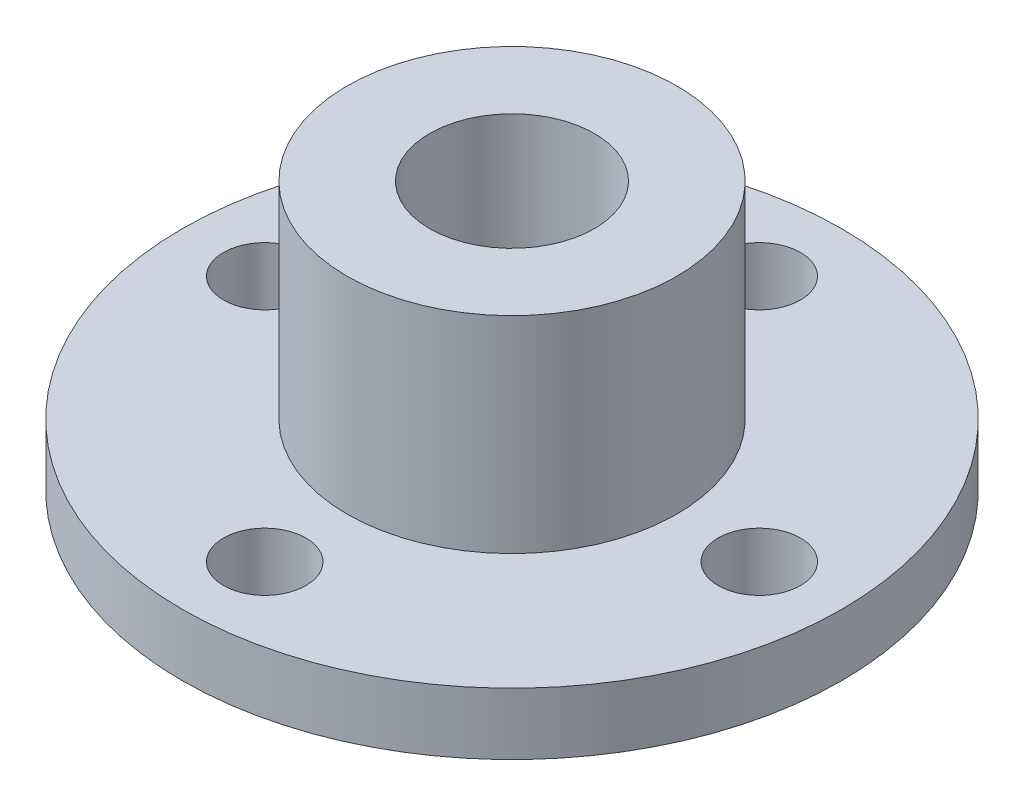
ISO-10303-21;
HEADER;
FILE_DESCRIPTION(('STEP AP214'),'2;1');
FILE_NAME('part.step','',(''),(''),'','','');
FILE_SCHEMA(('AUTOMOTIVE_DESIGN { 1 0 10303 214 1 1 1 1 }'));
ENDSEC;
DATA;
#1=APPLICATION_CONTEXT('core data for automotive mechanical design processes');
#2=APPLICATION_PROTOCOL_DEFINITION('international standard','automotive_design',2000,#1);
#3=PRODUCT_CONTEXT('',#1,'mechanical');
#4=PRODUCT('Part','Part','',(#3));
#5=PRODUCT_RELATED_PRODUCT_CATEGORY('part','',(#4));
#6=PRODUCT_DEFINITION_FORMATION('','',#4);
#7=PRODUCT_DEFINITION_CONTEXT('part definition',#1,'design');
#8=PRODUCT_DEFINITION('design','',#6,#7);
#9=PRODUCT_DEFINITION_SHAPE('','',#8);
#10=(LENGTH_UNIT() NAMED_UNIT(*) SI_UNIT(.MILLI.,.METRE.));
#11=(NAMED_UNIT(*) PLANE_ANGLE_UNIT() SI_UNIT($,.RADIAN.));
#12=(NAMED_UNIT(*) SI_UNIT($,.STERADIAN.) SOLID_ANGLE_UNIT());
#13=UNCERTAINTY_MEASURE_WITH_UNIT(LENGTH_MEASURE(1.E-05),#10,'distance_accuracy_value','');
#14=(GEOMETRIC_REPRESENTATION_CONTEXT(3) GLOBAL_UNCERTAINTY_ASSIGNED_CONTEXT((#13)) GLOBAL_UNIT_ASSIGNED_CONTEXT((#10,
#11,#12)) REPRESENTATION_CONTEXT('',''));
#15=CARTESIAN_POINT('',(0.,0.,0.));
#16=DIRECTION('',(0.,0.,1.));
#17=DIRECTION('',(1.,0.,0.));
#18=AXIS2_PLACEMENT_3D('',#15,#16,#17);
#19=CARTESIAN_POINT('',(0.,3.,0.));
#20=DIRECTION('',(0.,-1.,0.));
#21=DIRECTION('',(0.,0.,-1.));
#22=AXIS2_PLACEMENT_3D('',#19,#20,#21);
#23=CYLINDRICAL_SURFACE('',#22,16.);
#24=CARTESIAN_POINT('',(0.,3.,0.));
#25=DIRECTION('',(0.,1.,0.));
#26=DIRECTION('',(0.,0.,1.));
#27=AXIS2_PLACEMENT_3D('',#24,#25,#26);
#28=CIRCLE('',#27,16.);
#29=CARTESIAN_POINT('',(0.,3.,16.));
#30=VERTEX_POINT('',#29);
#31=EDGE_CURVE('E44',#30,#30,#28,.T.);
#32=ORIENTED_EDGE('',*,*,#31,.F.);
#33=EDGE_LOOP('',(#32));
#34=FACE_BOUND('',#33,.T.);
#35=CARTESIAN_POINT('',(0.,0.,0.));
#36=DIRECTION('',(0.,1.,0.));
#37=DIRECTION('',(0.,0.,1.));
#38=AXIS2_PLACEMENT_3D('',#35,#36,#37);
#39=CIRCLE('',#38,16.);
#40=CARTESIAN_POINT('',(0.,0.,16.));
#41=VERTEX_POINT('',#40);
#42=EDGE_CURVE('E49',#41,#41,#39,.T.);
#43=ORIENTED_EDGE('',*,*,#42,.T.);
#44=EDGE_LOOP('',(#43));
#45=FACE_BOUND('',#44,.T.);
#46=ADVANCED_FACE('F37',(#34,#45),#23,.T.);
#47=CARTESIAN_POINT('',(0.,3.,0.));
#48=DIRECTION('',(0.,1.,0.));
#49=DIRECTION('',(0.,0.,1.));
#50=AXIS2_PLACEMENT_3D('',#47,#48,#49);
#51=PLANE('',#50);
#52=CARTESIAN_POINT('',(0.,3.,-12.));
#53=DIRECTION('',(0.,1.,0.));
#54=DIRECTION('',(0.,0.,1.));
#55=AXIS2_PLACEMENT_3D('',#52,#53,#54);
#56=CIRCLE('',#55,2.);
#57=CARTESIAN_POINT('',(0.,3.,-10.));
#58=VERTEX_POINT('',#57);
#59=EDGE_CURVE('E61',#58,#58,#56,.T.);
#60=ORIENTED_EDGE('',*,*,#59,.F.);
#61=EDGE_LOOP('',(#60));
#62=FACE_BOUND('',#61,.T.);
#63=CARTESIAN_POINT('',(-12.,3.,0.));
#64=DIRECTION('',(0.,1.,0.));
#65=DIRECTION('',(0.,0.,1.));
#66=AXIS2_PLACEMENT_3D('',#63,#64,#65);
#67=CIRCLE('',#66,2.);
#68=CARTESIAN_POINT('',(-12.,3.,2.));
#69=VERTEX_POINT('',#68);
#70=EDGE_CURVE('E84',#69,#69,#67,.T.);
#71=ORIENTED_EDGE('',*,*,#70,.F.);
#72=EDGE_LOOP('',(#71));
#73=FACE_BOUND('',#72,.T.);
#74=CARTESIAN_POINT('',(0.,3.,12.));
#75=DIRECTION('',(0.,1.,0.));
#76=DIRECTION('',(0.,0.,1.));
#77=AXIS2_PLACEMENT_3D('',#74,#75,#76);
#78=CIRCLE('',#77,2.);
#79=CARTESIAN_POINT('',(0.,3.,14.));
#80=VERTEX_POINT('',#79);
#81=EDGE_CURVE('E81',#80,#80,#78,.T.);
#82=ORIENTED_EDGE('',*,*,#81,.F.);
#83=EDGE_LOOP('',(#82));
#84=FACE_BOUND('',#83,.T.);
#85=CARTESIAN_POINT('',(12.,3.,0.));
#86=DIRECTION('',(0.,1.,0.));
#87=DIRECTION('',(0.,0.,1.));
#88=AXIS2_PLACEMENT_3D('',#85,#86,#87);
#89=CIRCLE('',#88,2.);
#90=CARTESIAN_POINT('',(12.,3.,2.));
#91=VERTEX_POINT('',#90);
#92=EDGE_CURVE('E78',#91,#91,#89,.T.);
#93=ORIENTED_EDGE('',*,*,#92,.F.);
#94=EDGE_LOOP('',(#93));
#95=FACE_BOUND('',#94,.T.);
#96=CARTESIAN_POINT('',(0.,3.,0.));
#97=DIRECTION('',(0.,1.,0.));
#98=DIRECTION('',(0.,0.,1.));
#99=AXIS2_PLACEMENT_3D('',#96,#97,#98);
#100=CIRCLE('',#99,8.);
#101=CARTESIAN_POINT('',(0.,3.,8.));
#102=VERTEX_POINT('',#101);
#103=EDGE_CURVE('E10',#102,#102,#100,.T.);
#104=ORIENTED_EDGE('',*,*,#103,.F.);
#105=EDGE_LOOP('',(#104));
#106=FACE_BOUND('',#105,.T.);
#107=ORIENTED_EDGE('',*,*,#31,.T.);
#108=EDGE_LOOP('',(#107));
#109=FACE_BOUND('',#108,.T.);
#110=ADVANCED_FACE('F93',(#62,#73,#84,#95,#106,#109),#51,.T.);
#111=CARTESIAN_POINT('',(0.,0.,0.));
#112=DIRECTION('',(0.,1.,0.));
#113=DIRECTION('',(0.,0.,1.));
#114=AXIS2_PLACEMENT_3D('',#111,#112,#113);
#115=PLANE('',#114);
#116=CARTESIAN_POINT('',(0.,0.,-12.));
#117=DIRECTION('',(0.,1.,0.));
#118=DIRECTION('',(0.,0.,1.));
#119=AXIS2_PLACEMENT_3D('',#116,#117,#118);
#120=CIRCLE('',#119,2.);
#121=CARTESIAN_POINT('',(0.,0.,-10.));
#122=VERTEX_POINT('',#121);
#123=EDGE_CURVE('E40',#122,#122,#120,.T.);
#124=ORIENTED_EDGE('',*,*,#123,.T.);
#125=EDGE_LOOP('',(#124));
#126=FACE_BOUND('',#125,.T.);
#127=CARTESIAN_POINT('',(-12.,0.,0.));
#128=DIRECTION('',(0.,1.,0.));
#129=DIRECTION('',(0.,0.,1.));
#130=AXIS2_PLACEMENT_3D('',#127,#128,#129);
#131=CIRCLE('',#130,2.);
#132=CARTESIAN_POINT('',(-12.,0.,2.));
#133=VERTEX_POINT('',#132);
#134=EDGE_CURVE('E63',#133,#133,#131,.T.);
#135=ORIENTED_EDGE('',*,*,#134,.T.);
#136=EDGE_LOOP('',(#135));
#137=FACE_BOUND('',#136,.T.);
#138=CARTESIAN_POINT('',(0.,0.,12.));
#139=DIRECTION('',(0.,1.,0.));
#140=DIRECTION('',(0.,0.,1.));
#141=AXIS2_PLACEMENT_3D('',#138,#139,#140);
#142=CIRCLE('',#141,2.);
#143=CARTESIAN_POINT('',(0.,0.,14.));
#144=VERTEX_POINT('',#143);
#145=EDGE_CURVE('E60',#144,#144,#142,.T.);
#146=ORIENTED_EDGE('',*,*,#145,.T.);
#147=EDGE_LOOP('',(#146));
#148=FACE_BOUND('',#147,.T.);
#149=CARTESIAN_POINT('',(12.,0.,0.));
#150=DIRECTION('',(0.,1.,0.));
#151=DIRECTION('',(0.,0.,1.));
#152=AXIS2_PLACEMENT_3D('',#149,#150,#151);
#153=CIRCLE('',#152,2.);
#154=CARTESIAN_POINT('',(12.,0.,2.));
#155=VERTEX_POINT('',#154);
#156=EDGE_CURVE('E57',#155,#155,#153,.T.);
#157=ORIENTED_EDGE('',*,*,#156,.T.);
#158=EDGE_LOOP('',(#157));
#159=FACE_BOUND('',#158,.T.);
#160=ORIENTED_EDGE('',*,*,#42,.F.);
#161=EDGE_LOOP('',(#160));
#162=FACE_BOUND('',#161,.T.);
#163=ADVANCED_FACE('F96',(#126,#137,#148,#159,#162),#115,.F.);
#164=CARTESIAN_POINT('',(0.,13.,0.));
#165=DIRECTION('',(0.,-1.,0.));
#166=DIRECTION('',(0.,0.,-1.));
#167=AXIS2_PLACEMENT_3D('',#164,#165,#166);
#168=CYLINDRICAL_SURFACE('',#167,8.);
#169=CARTESIAN_POINT('',(0.,13.,0.));
#170=DIRECTION('',(0.,1.,0.));
#171=DIRECTION('',(0.,0.,1.));
#172=AXIS2_PLACEMENT_3D('',#169,#170,#171);
#173=CIRCLE('',#172,8.);
#174=CARTESIAN_POINT('',(0.,13.,8.));
#175=VERTEX_POINT('',#174);
#176=EDGE_CURVE('E52',#175,#175,#173,.T.);
#177=ORIENTED_EDGE('',*,*,#176,.F.);
#178=EDGE_LOOP('',(#177));
#179=FACE_BOUND('',#178,.T.);
#180=ORIENTED_EDGE('',*,*,#103,.T.);
#181=EDGE_LOOP('',(#180));
#182=FACE_BOUND('',#181,.T.);
#183=ADVANCED_FACE('F112',(#179,#182),#168,.T.);
#184=CARTESIAN_POINT('',(0.,13.,0.));
#185=DIRECTION('',(0.,1.,0.));
#186=DIRECTION('',(0.,0.,1.));
#187=AXIS2_PLACEMENT_3D('',#184,#185,#186);
#188=PLANE('',#187);
#189=CARTESIAN_POINT('',(0.,13.,0.));
#190=DIRECTION('',(0.,1.,0.));
#191=DIRECTION('',(0.,0.,1.));
#192=AXIS2_PLACEMENT_3D('',#189,#190,#191);
#193=CIRCLE('',#192,4.);
#194=CARTESIAN_POINT('',(0.,13.,4.));
#195=VERTEX_POINT('',#194);
#196=EDGE_CURVE('E68',#195,#195,#193,.T.);
#197=ORIENTED_EDGE('',*,*,#196,.F.);
#198=EDGE_LOOP('',(#197));
#199=FACE_BOUND('',#198,.T.);
#200=ORIENTED_EDGE('',*,*,#176,.T.);
#201=EDGE_LOOP('',(#200));
#202=FACE_BOUND('',#201,.T.);
#203=ADVANCED_FACE('F117',(#199,#202),#188,.T.);
#204=CARTESIAN_POINT('',(0.,3.,0.));
#205=DIRECTION('',(0.,1.,0.));
#206=DIRECTION('',(0.,0.,1.));
#207=AXIS2_PLACEMENT_3D('',#204,#205,#206);
#208=CYLINDRICAL_SURFACE('',#207,4.);
#209=CARTESIAN_POINT('',(0.,3.,0.));
#210=DIRECTION('',(0.,1.,0.));
#211=DIRECTION('',(0.,0.,1.));
#212=AXIS2_PLACEMENT_3D('',#209,#210,#211);
#213=CIRCLE('',#212,4.);
#214=CARTESIAN_POINT('',(0.,3.,4.));
#215=VERTEX_POINT('',#214);
#216=EDGE_CURVE('E72',#215,#215,#213,.T.);
#217=ORIENTED_EDGE('',*,*,#216,.F.);
#218=EDGE_LOOP('',(#217));
#219=FACE_BOUND('',#218,.T.);
#220=ORIENTED_EDGE('',*,*,#196,.T.);
#221=EDGE_LOOP('',(#220));
#222=FACE_BOUND('',#221,.T.);
#223=ADVANCED_FACE('F123',(#219,#222),#208,.F.);
#224=CARTESIAN_POINT('',(0.,3.,0.));
#225=DIRECTION('',(0.,1.,0.));
#226=DIRECTION('',(0.,0.,1.));
#227=AXIS2_PLACEMENT_3D('',#224,#225,#226);
#228=PLANE('',#227);
#229=ORIENTED_EDGE('',*,*,#216,.T.);
#230=EDGE_LOOP('',(#229));
#231=FACE_BOUND('',#230,.T.);
#232=ADVANCED_FACE('F127',(#231),#228,.T.);
#233=CARTESIAN_POINT('',(12.,-7.,0.));
#234=DIRECTION('',(0.,1.,0.));
#235=DIRECTION('',(0.,0.,1.));
#236=AXIS2_PLACEMENT_3D('',#233,#234,#235);
#237=CYLINDRICAL_SURFACE('',#236,2.);
#238=ORIENTED_EDGE('',*,*,#92,.T.);
#239=EDGE_LOOP('',(#238));
#240=FACE_BOUND('',#239,.T.);
#241=ORIENTED_EDGE('',*,*,#156,.F.);
#242=EDGE_LOOP('',(#241));
#243=FACE_BOUND('',#242,.T.);
#244=ADVANCED_FACE('F131',(#240,#243),#237,.F.);
#245=CARTESIAN_POINT('',(0.,-7.,12.));
#246=DIRECTION('',(0.,1.,0.));
#247=DIRECTION('',(0.,0.,1.));
#248=AXIS2_PLACEMENT_3D('',#245,#246,#247);
#249=CYLINDRICAL_SURFACE('',#248,2.);
#250=ORIENTED_EDGE('',*,*,#81,.T.);
#251=EDGE_LOOP('',(#250));
#252=FACE_BOUND('',#251,.T.);
#253=ORIENTED_EDGE('',*,*,#145,.F.);
#254=EDGE_LOOP('',(#253));
#255=FACE_BOUND('',#254,.T.);
#256=ADVANCED_FACE('F134',(#252,#255),#249,.F.);
#257=CARTESIAN_POINT('',(-12.,-7.,0.));
#258=DIRECTION('',(0.,1.,0.));
#259=DIRECTION('',(0.,0.,1.));
#260=AXIS2_PLACEMENT_3D('',#257,#258,#259);
#261=CYLINDRICAL_SURFACE('',#260,2.);
#262=ORIENTED_EDGE('',*,*,#70,.T.);
#263=EDGE_LOOP('',(#262));
#264=FACE_BOUND('',#263,.T.);
#265=ORIENTED_EDGE('',*,*,#134,.F.);
#266=EDGE_LOOP('',(#265));
#267=FACE_BOUND('',#266,.T.);
#268=ADVANCED_FACE('F138',(#264,#267),#261,.F.);
#269=CARTESIAN_POINT('',(0.,-7.,-12.));
#270=DIRECTION('',(0.,1.,0.));
#271=DIRECTION('',(0.,0.,1.));
#272=AXIS2_PLACEMENT_3D('',#269,#270,#271);
#273=CYLINDRICAL_SURFACE('',#272,2.);
#274=ORIENTED_EDGE('',*,*,#59,.T.);
#275=EDGE_LOOP('',(#274));
#276=FACE_BOUND('',#275,.T.);
#277=ORIENTED_EDGE('',*,*,#123,.F.);
#278=EDGE_LOOP('',(#277));
#279=FACE_BOUND('',#278,.T.);
#280=ADVANCED_FACE('F90',(#276,#279),#273,.F.);
#281=CLOSED_SHELL('',(#46,#110,#163,#183,#203,#223,#232,#244,#256,#268,#280));
#282=MANIFOLD_SOLID_BREP('B2',#281);
#283=ADVANCED_BREP_SHAPE_REPRESENTATION('',(#18,#282),#14);
#284=SHAPE_DEFINITION_REPRESENTATION(#9,#283);
ENDSEC;
END-ISO-10303-21;
